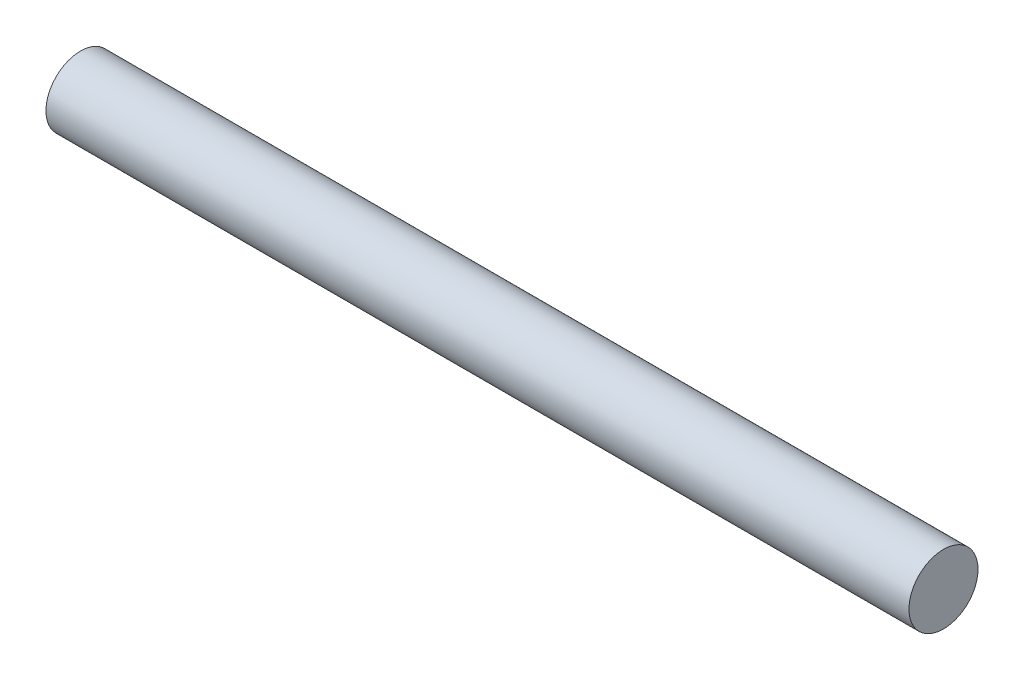
ISO-10303-21;
HEADER;
FILE_DESCRIPTION(('STEP AP214'),'2;1');
FILE_NAME('part.step','',(''),(''),'','','');
FILE_SCHEMA(('AUTOMOTIVE_DESIGN { 1 0 10303 214 1 1 1 1 }'));
ENDSEC;
DATA;
#1=APPLICATION_CONTEXT('core data for automotive mechanical design processes');
#2=APPLICATION_PROTOCOL_DEFINITION('international standard','automotive_design',2000,#1);
#3=PRODUCT_CONTEXT('',#1,'mechanical');
#4=PRODUCT('Part','Part','',(#3));
#5=PRODUCT_RELATED_PRODUCT_CATEGORY('part','',(#4));
#6=PRODUCT_DEFINITION_FORMATION('','',#4);
#7=PRODUCT_DEFINITION_CONTEXT('part definition',#1,'design');
#8=PRODUCT_DEFINITION('design','',#6,#7);
#9=PRODUCT_DEFINITION_SHAPE('','',#8);
#10=(LENGTH_UNIT() NAMED_UNIT(*) SI_UNIT(.MILLI.,.METRE.));
#11=(NAMED_UNIT(*) PLANE_ANGLE_UNIT() SI_UNIT($,.RADIAN.));
#12=(NAMED_UNIT(*) SI_UNIT($,.STERADIAN.) SOLID_ANGLE_UNIT());
#13=UNCERTAINTY_MEASURE_WITH_UNIT(LENGTH_MEASURE(1.E-05),#10,'distance_accuracy_value','');
#14=(GEOMETRIC_REPRESENTATION_CONTEXT(3) GLOBAL_UNCERTAINTY_ASSIGNED_CONTEXT((#13)) GLOBAL_UNIT_ASSIGNED_CONTEXT((#10,
#11,#12)) REPRESENTATION_CONTEXT('',''));
#15=CARTESIAN_POINT('',(0.,0.,0.));
#16=DIRECTION('',(0.,0.,1.));
#17=DIRECTION('',(1.,0.,0.));
#18=AXIS2_PLACEMENT_3D('',#15,#16,#17);
#19=CARTESIAN_POINT('',(100.,0.,0.));
#20=DIRECTION('',(-1.,0.,0.));
#21=DIRECTION('',(0.,0.,1.));
#22=AXIS2_PLACEMENT_3D('',#19,#20,#21);
#23=CYLINDRICAL_SURFACE('',#22,4.);
#24=CARTESIAN_POINT('',(100.,0.,0.));
#25=DIRECTION('',(1.,0.,0.));
#26=DIRECTION('',(0.,0.,-1.));
#27=AXIS2_PLACEMENT_3D('',#24,#25,#26);
#28=CIRCLE('',#27,4.);
#29=CARTESIAN_POINT('',(100.,0.,-4.));
#30=VERTEX_POINT('',#29);
#31=EDGE_CURVE('E10',#30,#30,#28,.T.);
#32=ORIENTED_EDGE('',*,*,#31,.F.);
#33=EDGE_LOOP('',(#32));
#34=FACE_BOUND('',#33,.T.);
#35=CARTESIAN_POINT('',(0.,0.,0.));
#36=DIRECTION('',(1.,0.,0.));
#37=DIRECTION('',(0.,0.,-1.));
#38=AXIS2_PLACEMENT_3D('',#35,#36,#37);
#39=CIRCLE('',#38,4.);
#40=CARTESIAN_POINT('',(0.,0.,-4.));
#41=VERTEX_POINT('',#40);
#42=EDGE_CURVE('E44',#41,#41,#39,.T.);
#43=ORIENTED_EDGE('',*,*,#42,.T.);
#44=EDGE_LOOP('',(#43));
#45=FACE_BOUND('',#44,.T.);
#46=ADVANCED_FACE('F41',(#34,#45),#23,.T.);
#47=CARTESIAN_POINT('',(100.,0.,0.));
#48=DIRECTION('',(1.,0.,0.));
#49=DIRECTION('',(0.,0.,-1.));
#50=AXIS2_PLACEMENT_3D('',#47,#48,#49);
#51=PLANE('',#50);
#52=ORIENTED_EDGE('',*,*,#31,.T.);
#53=EDGE_LOOP('',(#52));
#54=FACE_BOUND('',#53,.T.);
#55=ADVANCED_FACE('F58',(#54),#51,.T.);
#56=CARTESIAN_POINT('',(0.,0.,0.));
#57=DIRECTION('',(1.,0.,0.));
#58=DIRECTION('',(0.,0.,-1.));
#59=AXIS2_PLACEMENT_3D('',#56,#57,#58);
#60=PLANE('',#59);
#61=ORIENTED_EDGE('',*,*,#42,.F.);
#62=EDGE_LOOP('',(#61));
#63=FACE_BOUND('',#62,.T.);
#64=ADVANCED_FACE('F56',(#63),#60,.F.);
#65=CLOSED_SHELL('',(#46,#55,#64));
#66=MANIFOLD_SOLID_BREP('B2',#65);
#67=ADVANCED_BREP_SHAPE_REPRESENTATION('',(#18,#66),#14);
#68=SHAPE_DEFINITION_REPRESENTATION(#9,#67);
ENDSEC;
END-ISO-10303-21;
